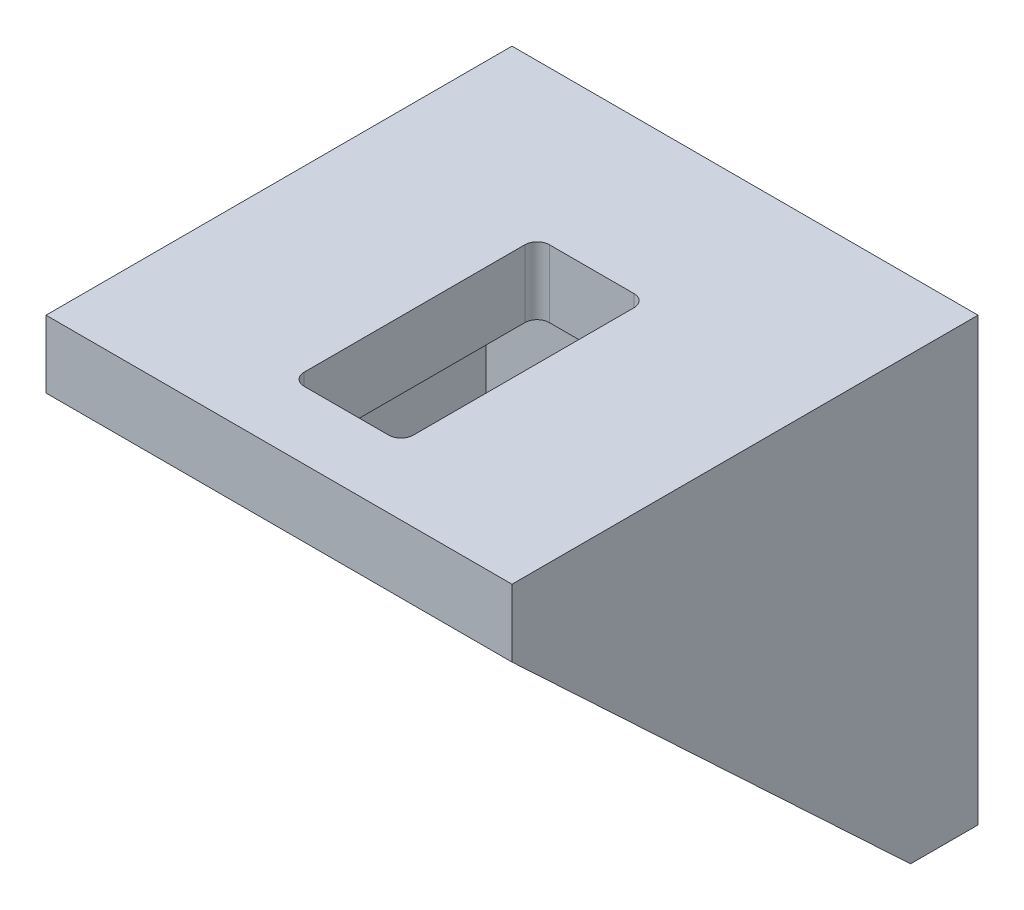
ISO-10303-21;
HEADER;
FILE_DESCRIPTION(('STEP AP214'),'2;1');
FILE_NAME('part.step','',(''),(''),'','','');
FILE_SCHEMA(('AUTOMOTIVE_DESIGN { 1 0 10303 214 1 1 1 1 }'));
ENDSEC;
DATA;
#1=APPLICATION_CONTEXT('core data for automotive mechanical design processes');
#2=APPLICATION_PROTOCOL_DEFINITION('international standard','automotive_design',2000,#1);
#3=PRODUCT_CONTEXT('',#1,'mechanical');
#4=PRODUCT('Part','Part','',(#3));
#5=PRODUCT_RELATED_PRODUCT_CATEGORY('part','',(#4));
#6=PRODUCT_DEFINITION_FORMATION('','',#4);
#7=PRODUCT_DEFINITION_CONTEXT('part definition',#1,'design');
#8=PRODUCT_DEFINITION('design','',#6,#7);
#9=PRODUCT_DEFINITION_SHAPE('','',#8);
#10=(LENGTH_UNIT() NAMED_UNIT(*) SI_UNIT(.MILLI.,.METRE.));
#11=(NAMED_UNIT(*) PLANE_ANGLE_UNIT() SI_UNIT($,.RADIAN.));
#12=(NAMED_UNIT(*) SI_UNIT($,.STERADIAN.) SOLID_ANGLE_UNIT());
#13=UNCERTAINTY_MEASURE_WITH_UNIT(LENGTH_MEASURE(1.E-05),#10,'distance_accuracy_value','');
#14=(GEOMETRIC_REPRESENTATION_CONTEXT(3) GLOBAL_UNCERTAINTY_ASSIGNED_CONTEXT((#13)) GLOBAL_UNIT_ASSIGNED_CONTEXT((#10,
#11,#12)) REPRESENTATION_CONTEXT('',''));
#15=CARTESIAN_POINT('',(0.,0.,0.));
#16=DIRECTION('',(0.,0.,1.));
#17=DIRECTION('',(1.,0.,0.));
#18=AXIS2_PLACEMENT_3D('',#15,#16,#17);
#19=CARTESIAN_POINT('',(18.,18.,3.));
#20=DIRECTION('',(0.,0.,-1.));
#21=DIRECTION('',(-1.,0.,0.));
#22=AXIS2_PLACEMENT_3D('',#19,#20,#21);
#23=CYLINDRICAL_SURFACE('',#22,10.);
#24=CARTESIAN_POINT('',(18.,18.,3.));
#25=DIRECTION('',(0.,0.,-1.));
#26=DIRECTION('',(-1.,0.,0.));
#27=AXIS2_PLACEMENT_3D('',#24,#25,#26);
#28=CIRCLE('',#27,10.);
#29=CARTESIAN_POINT('',(8.46060798583053,21.,3.));
#30=VERTEX_POINT('',#29);
#31=CARTESIAN_POINT('',(27.5,21.1224989991992,3.));
#32=VERTEX_POINT('',#31);
#33=EDGE_CURVE('E230',#30,#32,#28,.T.);
#34=ORIENTED_EDGE('',*,*,#33,.F.);
#35=DIRECTION('',(0.,0.,-1.));
#36=VECTOR('',#35,1.);
#37=CARTESIAN_POINT('',(8.46060798583054,21.,3.));
#38=LINE('',#37,#36);
#39=CARTESIAN_POINT('',(8.46060798583054,21.,0.));
#40=VERTEX_POINT('',#39);
#41=EDGE_CURVE('E640',#30,#40,#38,.T.);
#42=ORIENTED_EDGE('',*,*,#41,.T.);
#43=CARTESIAN_POINT('',(18.,18.,0.));
#44=DIRECTION('',(0.,0.,-1.));
#45=DIRECTION('',(-1.,0.,0.));
#46=AXIS2_PLACEMENT_3D('',#43,#44,#45);
#47=CIRCLE('',#46,10.);
#48=CARTESIAN_POINT('',(27.5,21.1224989991992,0.));
#49=VERTEX_POINT('',#48);
#50=EDGE_CURVE('E80',#40,#49,#47,.T.);
#51=ORIENTED_EDGE('',*,*,#50,.T.);
#52=DIRECTION('',(0.,0.,-1.));
#53=VECTOR('',#52,1.);
#54=CARTESIAN_POINT('',(27.5,21.1224989991992,3.));
#55=LINE('',#54,#53);
#56=EDGE_CURVE('E240',#32,#49,#55,.T.);
#57=ORIENTED_EDGE('',*,*,#56,.F.);
#58=EDGE_LOOP('',(#34,#42,#51,#57));
#59=FACE_BOUND('',#58,.T.);
#60=ADVANCED_FACE('F57',(#59),#23,.F.);
#61=CARTESIAN_POINT('',(0.,0.,5.5));
#62=DIRECTION('',(0.,0.,-1.));
#63=DIRECTION('',(-1.,0.,0.));
#64=AXIS2_PLACEMENT_3D('',#61,#62,#63);
#65=PLANE('',#64);
#66=DIRECTION('',(0.,1.,0.));
#67=VECTOR('',#66,1.);
#68=CARTESIAN_POINT('',(34.6,0.,5.5));
#69=LINE('',#68,#67);
#70=CARTESIAN_POINT('',(34.6,0.,5.5));
#71=VERTEX_POINT('',#70);
#72=CARTESIAN_POINT('',(34.6,30.5,5.5));
#73=VERTEX_POINT('',#72);
#74=EDGE_CURVE('E271',#71,#73,#69,.T.);
#75=ORIENTED_EDGE('',*,*,#74,.T.);
#76=DIRECTION('',(1.,0.,0.));
#77=VECTOR('',#76,1.);
#78=CARTESIAN_POINT('',(0.,30.5,5.5));
#79=LINE('',#78,#77);
#80=CARTESIAN_POINT('',(3.4,30.5,5.5));
#81=VERTEX_POINT('',#80);
#82=EDGE_CURVE('E294',#81,#73,#79,.T.);
#83=ORIENTED_EDGE('',*,*,#82,.F.);
#84=DIRECTION('',(0.,-1.,0.));
#85=VECTOR('',#84,1.);
#86=CARTESIAN_POINT('',(3.4,30.5,5.5));
#87=LINE('',#86,#85);
#88=CARTESIAN_POINT('',(3.4,0.,5.5));
#89=VERTEX_POINT('',#88);
#90=EDGE_CURVE('E285',#81,#89,#87,.T.);
#91=ORIENTED_EDGE('',*,*,#90,.T.);
#92=DIRECTION('',(1.,0.,0.));
#93=VECTOR('',#92,1.);
#94=CARTESIAN_POINT('',(0.,0.,5.5));
#95=LINE('',#94,#93);
#96=EDGE_CURVE('E316',#89,#71,#95,.T.);
#97=ORIENTED_EDGE('',*,*,#96,.T.);
#98=EDGE_LOOP('',(#75,#83,#91,#97));
#99=FACE_BOUND('',#98,.T.);
#100=ADVANCED_FACE('F417',(#99),#65,.F.);
#101=CARTESIAN_POINT('',(0.,30.5,38.));
#102=DIRECTION('',(0.,1.,0.));
#103=DIRECTION('',(0.,0.,1.));
#104=AXIS2_PLACEMENT_3D('',#101,#102,#103);
#105=PLANE('',#104);
#106=DIRECTION('',(-1.,0.,0.));
#107=VECTOR('',#106,1.);
#108=CARTESIAN_POINT('',(23.45,30.5,32.5));
#109=LINE('',#108,#107);
#110=CARTESIAN_POINT('',(22.45,30.5,32.5));
#111=VERTEX_POINT('',#110);
#112=CARTESIAN_POINT('',(15.55,30.5,32.5));
#113=VERTEX_POINT('',#112);
#114=EDGE_CURVE('E260',#111,#113,#109,.T.);
#115=ORIENTED_EDGE('',*,*,#114,.F.);
#116=CARTESIAN_POINT('',(22.45,30.5,31.5));
#117=DIRECTION('',(0.,1.,0.));
#118=DIRECTION('',(0.,0.,1.));
#119=AXIS2_PLACEMENT_3D('',#116,#117,#118);
#120=CIRCLE('',#119,1.);
#121=CARTESIAN_POINT('',(23.45,30.5,31.5));
#122=VERTEX_POINT('',#121);
#123=EDGE_CURVE('E357',#111,#122,#120,.T.);
#124=ORIENTED_EDGE('',*,*,#123,.T.);
#125=DIRECTION('',(0.,0.,1.));
#126=VECTOR('',#125,1.);
#127=CARTESIAN_POINT('',(23.45,30.5,12.5));
#128=LINE('',#127,#126);
#129=CARTESIAN_POINT('',(23.45,30.5,13.5));
#130=VERTEX_POINT('',#129);
#131=EDGE_CURVE('E242',#130,#122,#128,.T.);
#132=ORIENTED_EDGE('',*,*,#131,.F.);
#133=CARTESIAN_POINT('',(22.45,30.5,13.5));
#134=DIRECTION('',(0.,1.,0.));
#135=DIRECTION('',(0.,0.,1.));
#136=AXIS2_PLACEMENT_3D('',#133,#134,#135);
#137=CIRCLE('',#136,1.);
#138=CARTESIAN_POINT('',(22.45,30.5,12.5));
#139=VERTEX_POINT('',#138);
#140=EDGE_CURVE('E365',#130,#139,#137,.T.);
#141=ORIENTED_EDGE('',*,*,#140,.T.);
#142=DIRECTION('',(1.,0.,0.));
#143=VECTOR('',#142,1.);
#144=CARTESIAN_POINT('',(23.45,30.5,12.5));
#145=LINE('',#144,#143);
#146=CARTESIAN_POINT('',(15.55,30.5,12.5));
#147=VERTEX_POINT('',#146);
#148=EDGE_CURVE('E248',#147,#139,#145,.T.);
#149=ORIENTED_EDGE('',*,*,#148,.F.);
#150=CARTESIAN_POINT('',(15.55,30.5,13.5));
#151=DIRECTION('',(0.,1.,0.));
#152=DIRECTION('',(0.,0.,1.));
#153=AXIS2_PLACEMENT_3D('',#150,#151,#152);
#154=CIRCLE('',#153,1.);
#155=CARTESIAN_POINT('',(14.55,30.5,13.5));
#156=VERTEX_POINT('',#155);
#157=EDGE_CURVE('E65',#147,#156,#154,.T.);
#158=ORIENTED_EDGE('',*,*,#157,.T.);
#159=DIRECTION('',(0.,0.,-1.));
#160=VECTOR('',#159,1.);
#161=CARTESIAN_POINT('',(14.55,30.5,12.5));
#162=LINE('',#161,#160);
#163=CARTESIAN_POINT('',(14.55,30.5,31.5));
#164=VERTEX_POINT('',#163);
#165=EDGE_CURVE('E263',#164,#156,#162,.T.);
#166=ORIENTED_EDGE('',*,*,#165,.F.);
#167=CARTESIAN_POINT('',(15.55,30.5,31.5));
#168=DIRECTION('',(0.,1.,0.));
#169=DIRECTION('',(0.,0.,1.));
#170=AXIS2_PLACEMENT_3D('',#167,#168,#169);
#171=CIRCLE('',#170,1.);
#172=EDGE_CURVE('E361',#164,#113,#171,.T.);
#173=ORIENTED_EDGE('',*,*,#172,.T.);
#174=EDGE_LOOP('',(#115,#124,#132,#141,#149,#158,#166,#173));
#175=FACE_BOUND('',#174,.T.);
#176=DIRECTION('',(0.,0.,1.));
#177=VECTOR('',#176,1.);
#178=CARTESIAN_POINT('',(34.6,30.5,5.5));
#179=LINE('',#178,#177);
#180=CARTESIAN_POINT('',(34.6,30.5,38.));
#181=VERTEX_POINT('',#180);
#182=EDGE_CURVE('E274',#73,#181,#179,.T.);
#183=ORIENTED_EDGE('',*,*,#182,.T.);
#184=DIRECTION('',(1.,0.,0.));
#185=VECTOR('',#184,1.);
#186=CARTESIAN_POINT('',(0.,30.5,38.));
#187=LINE('',#186,#185);
#188=CARTESIAN_POINT('',(3.4,30.5,38.));
#189=VERTEX_POINT('',#188);
#190=EDGE_CURVE('E300',#189,#181,#187,.T.);
#191=ORIENTED_EDGE('',*,*,#190,.F.);
#192=DIRECTION('',(0.,0.,-1.));
#193=VECTOR('',#192,1.);
#194=CARTESIAN_POINT('',(3.4,30.5,38.));
#195=LINE('',#194,#193);
#196=EDGE_CURVE('E291',#189,#81,#195,.T.);
#197=ORIENTED_EDGE('',*,*,#196,.T.);
#198=ORIENTED_EDGE('',*,*,#82,.T.);
#199=EDGE_LOOP('',(#183,#191,#197,#198));
#200=FACE_BOUND('',#199,.T.);
#201=ADVANCED_FACE('F372',(#175,#200),#105,.F.);
#202=CARTESIAN_POINT('',(0.,0.,5.5));
#203=DIRECTION('',(1.,0.,0.));
#204=DIRECTION('',(0.,0.,-1.));
#205=AXIS2_PLACEMENT_3D('',#202,#203,#204);
#206=PLANE('',#205);
#207=DIRECTION('',(0.,-1.,0.));
#208=VECTOR('',#207,1.);
#209=CARTESIAN_POINT('',(0.,0.,0.));
#210=LINE('',#209,#208);
#211=CARTESIAN_POINT('',(0.,36.,0.));
#212=VERTEX_POINT('',#211);
#213=CARTESIAN_POINT('',(0.,21.,0.));
#214=VERTEX_POINT('',#213);
#215=EDGE_CURVE('E317',#212,#214,#210,.T.);
#216=ORIENTED_EDGE('',*,*,#215,.T.);
#217=DIRECTION('',(0.,0.,-1.));
#218=VECTOR('',#217,1.);
#219=CARTESIAN_POINT('',(0.,21.,3.));
#220=LINE('',#219,#218);
#221=CARTESIAN_POINT('',(0.,21.,3.));
#222=VERTEX_POINT('',#221);
#223=EDGE_CURVE('E642',#222,#214,#220,.T.);
#224=ORIENTED_EDGE('',*,*,#223,.F.);
#225=DIRECTION('',(0.,1.,0.));
#226=VECTOR('',#225,1.);
#227=CARTESIAN_POINT('',(0.,21.,3.));
#228=LINE('',#227,#226);
#229=CARTESIAN_POINT('',(0.,15.,3.));
#230=VERTEX_POINT('',#229);
#231=EDGE_CURVE('E215',#230,#222,#228,.T.);
#232=ORIENTED_EDGE('',*,*,#231,.F.);
#233=DIRECTION('',(0.,0.,-1.));
#234=VECTOR('',#233,1.);
#235=CARTESIAN_POINT('',(0.,15.,3.));
#236=LINE('',#235,#234);
#237=CARTESIAN_POINT('',(0.,15.,0.));
#238=VERTEX_POINT('',#237);
#239=EDGE_CURVE('E212',#230,#238,#236,.T.);
#240=ORIENTED_EDGE('',*,*,#239,.T.);
#241=CARTESIAN_POINT('',(0.,0.,0.));
#242=VERTEX_POINT('',#241);
#243=EDGE_CURVE('E310',#238,#242,#210,.T.);
#244=ORIENTED_EDGE('',*,*,#243,.T.);
#245=DIRECTION('',(0.,0.,-1.));
#246=VECTOR('',#245,1.);
#247=CARTESIAN_POINT('',(0.,0.,5.5));
#248=LINE('',#247,#246);
#249=CARTESIAN_POINT('',(0.,0.,5.5));
#250=VERTEX_POINT('',#249);
#251=EDGE_CURVE('E334',#250,#242,#248,.T.);
#252=ORIENTED_EDGE('',*,*,#251,.F.);
#253=DIRECTION('',(0.,0.684314204169172,0.729187266737642));
#254=VECTOR('',#253,1.);
#255=CARTESIAN_POINT('',(0.,0.,5.5));
#256=LINE('',#255,#254);
#257=CARTESIAN_POINT('',(0.,30.5,38.));
#258=VERTEX_POINT('',#257);
#259=EDGE_CURVE('E283',#250,#258,#256,.T.);
#260=ORIENTED_EDGE('',*,*,#259,.T.);
#261=DIRECTION('',(0.,-1.,0.));
#262=VECTOR('',#261,1.);
#263=CARTESIAN_POINT('',(0.,36.,38.));
#264=LINE('',#263,#262);
#265=CARTESIAN_POINT('',(0.,36.,38.));
#266=VERTEX_POINT('',#265);
#267=EDGE_CURVE('E297',#266,#258,#264,.T.);
#268=ORIENTED_EDGE('',*,*,#267,.F.);
#269=DIRECTION('',(0.,0.,-1.));
#270=VECTOR('',#269,1.);
#271=CARTESIAN_POINT('',(0.,36.,5.5));
#272=LINE('',#271,#270);
#273=EDGE_CURVE('E315',#266,#212,#272,.T.);
#274=ORIENTED_EDGE('',*,*,#273,.T.);
#275=EDGE_LOOP('',(#216,#224,#232,#240,#244,#252,#260,#268,#274));
#276=FACE_BOUND('',#275,.T.);
#277=ADVANCED_FACE('F510',(#276),#206,.F.);
#278=CARTESIAN_POINT('',(0.,0.,5.5));
#279=DIRECTION('',(0.,1.,0.));
#280=DIRECTION('',(0.,0.,1.));
#281=AXIS2_PLACEMENT_3D('',#278,#279,#280);
#282=PLANE('',#281);
#283=DIRECTION('',(1.,0.,0.));
#284=VECTOR('',#283,1.);
#285=CARTESIAN_POINT('',(0.,0.,0.));
#286=LINE('',#285,#284);
#287=CARTESIAN_POINT('',(38.,0.,0.));
#288=VERTEX_POINT('',#287);
#289=EDGE_CURVE('E320',#242,#288,#286,.T.);
#290=ORIENTED_EDGE('',*,*,#289,.T.);
#291=DIRECTION('',(0.,0.,-1.));
#292=VECTOR('',#291,1.);
#293=CARTESIAN_POINT('',(38.,0.,5.5));
#294=LINE('',#293,#292);
#295=CARTESIAN_POINT('',(38.,0.,5.5));
#296=VERTEX_POINT('',#295);
#297=EDGE_CURVE('E331',#296,#288,#294,.T.);
#298=ORIENTED_EDGE('',*,*,#297,.F.);
#299=DIRECTION('',(1.,0.,0.));
#300=VECTOR('',#299,1.);
#301=CARTESIAN_POINT('',(34.6,0.,5.5));
#302=LINE('',#301,#300);
#303=EDGE_CURVE('E277',#71,#296,#302,.T.);
#304=ORIENTED_EDGE('',*,*,#303,.F.);
#305=ORIENTED_EDGE('',*,*,#96,.F.);
#306=EDGE_CURVE('E313',#250,#89,#95,.T.);
#307=ORIENTED_EDGE('',*,*,#306,.F.);
#308=ORIENTED_EDGE('',*,*,#251,.T.);
#309=EDGE_LOOP('',(#290,#298,#304,#305,#307,#308));
#310=FACE_BOUND('',#309,.T.);
#311=ADVANCED_FACE('F552',(#310),#282,.F.);
#312=CARTESIAN_POINT('',(38.,0.,5.5));
#313=DIRECTION('',(-1.,0.,0.));
#314=DIRECTION('',(0.,0.,1.));
#315=AXIS2_PLACEMENT_3D('',#312,#313,#314);
#316=PLANE('',#315);
#317=DIRECTION('',(0.,1.,0.));
#318=VECTOR('',#317,1.);
#319=CARTESIAN_POINT('',(38.,0.,0.));
#320=LINE('',#319,#318);
#321=CARTESIAN_POINT('',(38.,36.,0.));
#322=VERTEX_POINT('',#321);
#323=EDGE_CURVE('E322',#288,#322,#320,.T.);
#324=ORIENTED_EDGE('',*,*,#323,.T.);
#325=DIRECTION('',(0.,0.,-1.));
#326=VECTOR('',#325,1.);
#327=CARTESIAN_POINT('',(38.,36.,5.5));
#328=LINE('',#327,#326);
#329=CARTESIAN_POINT('',(38.,36.,38.));
#330=VERTEX_POINT('',#329);
#331=EDGE_CURVE('E328',#330,#322,#328,.T.);
#332=ORIENTED_EDGE('',*,*,#331,.F.);
#333=DIRECTION('',(0.,1.,0.));
#334=VECTOR('',#333,1.);
#335=CARTESIAN_POINT('',(38.,36.,38.));
#336=LINE('',#335,#334);
#337=CARTESIAN_POINT('',(38.,30.5,38.));
#338=VERTEX_POINT('',#337);
#339=EDGE_CURVE('E304',#338,#330,#336,.T.);
#340=ORIENTED_EDGE('',*,*,#339,.F.);
#341=DIRECTION('',(0.,-0.684314204169172,-0.729187266737642));
#342=VECTOR('',#341,1.);
#343=CARTESIAN_POINT('',(38.,30.5,38.));
#344=LINE('',#343,#342);
#345=EDGE_CURVE('E257',#338,#296,#344,.T.);
#346=ORIENTED_EDGE('',*,*,#345,.T.);
#347=ORIENTED_EDGE('',*,*,#297,.T.);
#348=EDGE_LOOP('',(#324,#332,#340,#346,#347));
#349=FACE_BOUND('',#348,.T.);
#350=ADVANCED_FACE('F496',(#349),#316,.F.);
#351=CARTESIAN_POINT('',(0.,36.,5.5));
#352=DIRECTION('',(0.,-1.,0.));
#353=DIRECTION('',(0.,0.,-1.));
#354=AXIS2_PLACEMENT_3D('',#351,#352,#353);
#355=PLANE('',#354);
#356=DIRECTION('',(0.,0.,-1.));
#357=VECTOR('',#356,1.);
#358=CARTESIAN_POINT('',(14.55,36.,12.5));
#359=LINE('',#358,#357);
#360=CARTESIAN_POINT('',(14.55,36.,31.5));
#361=VERTEX_POINT('',#360);
#362=CARTESIAN_POINT('',(14.55,36.,13.5));
#363=VERTEX_POINT('',#362);
#364=EDGE_CURVE('E251',#361,#363,#359,.T.);
#365=ORIENTED_EDGE('',*,*,#364,.T.);
#366=CARTESIAN_POINT('',(15.55,36.,13.5));
#367=DIRECTION('',(0.,-1.,0.));
#368=DIRECTION('',(0.,0.,-1.));
#369=AXIS2_PLACEMENT_3D('',#366,#367,#368);
#370=CIRCLE('',#369,1.);
#371=CARTESIAN_POINT('',(15.55,36.,12.5));
#372=VERTEX_POINT('',#371);
#373=EDGE_CURVE('E13',#363,#372,#370,.T.);
#374=ORIENTED_EDGE('',*,*,#373,.T.);
#375=DIRECTION('',(1.,0.,0.));
#376=VECTOR('',#375,1.);
#377=CARTESIAN_POINT('',(23.45,36.,12.5));
#378=LINE('',#377,#376);
#379=CARTESIAN_POINT('',(22.45,36.,12.5));
#380=VERTEX_POINT('',#379);
#381=EDGE_CURVE('E254',#372,#380,#378,.T.);
#382=ORIENTED_EDGE('',*,*,#381,.T.);
#383=CARTESIAN_POINT('',(22.45,36.,13.5));
#384=DIRECTION('',(0.,-1.,0.));
#385=DIRECTION('',(0.,0.,-1.));
#386=AXIS2_PLACEMENT_3D('',#383,#384,#385);
#387=CIRCLE('',#386,1.);
#388=CARTESIAN_POINT('',(23.45,36.,13.5));
#389=VERTEX_POINT('',#388);
#390=EDGE_CURVE('E367',#380,#389,#387,.T.);
#391=ORIENTED_EDGE('',*,*,#390,.T.);
#392=DIRECTION('',(0.,0.,1.));
#393=VECTOR('',#392,1.);
#394=CARTESIAN_POINT('',(23.45,36.,12.5));
#395=LINE('',#394,#393);
#396=CARTESIAN_POINT('',(23.45,36.,31.5));
#397=VERTEX_POINT('',#396);
#398=EDGE_CURVE('E244',#389,#397,#395,.T.);
#399=ORIENTED_EDGE('',*,*,#398,.T.);
#400=CARTESIAN_POINT('',(22.45,36.,31.5));
#401=DIRECTION('',(0.,-1.,0.));
#402=DIRECTION('',(0.,0.,-1.));
#403=AXIS2_PLACEMENT_3D('',#400,#401,#402);
#404=CIRCLE('',#403,1.);
#405=CARTESIAN_POINT('',(22.45,36.,32.5));
#406=VERTEX_POINT('',#405);
#407=EDGE_CURVE('E359',#397,#406,#404,.T.);
#408=ORIENTED_EDGE('',*,*,#407,.T.);
#409=DIRECTION('',(-1.,0.,0.));
#410=VECTOR('',#409,1.);
#411=CARTESIAN_POINT('',(23.45,36.,32.5));
#412=LINE('',#411,#410);
#413=CARTESIAN_POINT('',(15.55,36.,32.5));
#414=VERTEX_POINT('',#413);
#415=EDGE_CURVE('E247',#406,#414,#412,.T.);
#416=ORIENTED_EDGE('',*,*,#415,.T.);
#417=CARTESIAN_POINT('',(15.55,36.,31.5));
#418=DIRECTION('',(0.,-1.,0.));
#419=DIRECTION('',(0.,0.,-1.));
#420=AXIS2_PLACEMENT_3D('',#417,#418,#419);
#421=CIRCLE('',#420,1.);
#422=EDGE_CURVE('E363',#414,#361,#421,.T.);
#423=ORIENTED_EDGE('',*,*,#422,.T.);
#424=EDGE_LOOP('',(#365,#374,#382,#391,#399,#408,#416,#423));
#425=FACE_BOUND('',#424,.T.);
#426=DIRECTION('',(-1.,0.,0.));
#427=VECTOR('',#426,1.);
#428=CARTESIAN_POINT('',(0.,36.,0.));
#429=LINE('',#428,#427);
#430=EDGE_CURVE('E324',#322,#212,#429,.T.);
#431=ORIENTED_EDGE('',*,*,#430,.T.);
#432=ORIENTED_EDGE('',*,*,#273,.F.);
#433=DIRECTION('',(-1.,0.,0.));
#434=VECTOR('',#433,1.);
#435=CARTESIAN_POINT('',(0.,36.,38.));
#436=LINE('',#435,#434);
#437=EDGE_CURVE('E307',#330,#266,#436,.T.);
#438=ORIENTED_EDGE('',*,*,#437,.F.);
#439=ORIENTED_EDGE('',*,*,#331,.T.);
#440=EDGE_LOOP('',(#431,#432,#438,#439));
#441=FACE_BOUND('',#440,.T.);
#442=ADVANCED_FACE('F384',(#425,#441),#355,.F.);
#443=CARTESIAN_POINT('',(0.,0.,0.));
#444=DIRECTION('',(0.,0.,-1.));
#445=DIRECTION('',(-1.,0.,0.));
#446=AXIS2_PLACEMENT_3D('',#443,#444,#445);
#447=PLANE('',#446);
#448=DIRECTION('',(1.,0.,0.));
#449=VECTOR('',#448,1.);
#450=CARTESIAN_POINT('',(8.46060798583054,21.,0.));
#451=LINE('',#450,#449);
#452=EDGE_CURVE('E216',#214,#40,#451,.T.);
#453=ORIENTED_EDGE('',*,*,#452,.F.);
#454=ORIENTED_EDGE('',*,*,#215,.F.);
#455=ORIENTED_EDGE('',*,*,#430,.F.);
#456=ORIENTED_EDGE('',*,*,#323,.F.);
#457=ORIENTED_EDGE('',*,*,#289,.F.);
#458=ORIENTED_EDGE('',*,*,#243,.F.);
#459=DIRECTION('',(-1.,0.,0.));
#460=VECTOR('',#459,1.);
#461=CARTESIAN_POINT('',(8.46060798583054,15.,0.));
#462=LINE('',#461,#460);
#463=CARTESIAN_POINT('',(8.46060798583054,15.,0.));
#464=VERTEX_POINT('',#463);
#465=EDGE_CURVE('E644',#464,#238,#462,.T.);
#466=ORIENTED_EDGE('',*,*,#465,.F.);
#467=CARTESIAN_POINT('',(27.5,14.8775010008008,0.));
#468=VERTEX_POINT('',#467);
#469=EDGE_CURVE('E224',#468,#464,#47,.T.);
#470=ORIENTED_EDGE('',*,*,#469,.F.);
#471=DIRECTION('',(0.,-1.,0.));
#472=VECTOR('',#471,1.);
#473=CARTESIAN_POINT('',(27.5,0.,0.));
#474=LINE('',#473,#472);
#475=EDGE_CURVE('E234',#49,#468,#474,.T.);
#476=ORIENTED_EDGE('',*,*,#475,.F.);
#477=ORIENTED_EDGE('',*,*,#50,.F.);
#478=EDGE_LOOP('',(#453,#454,#455,#456,#457,#458,#466,#470,#476,#477));
#479=FACE_BOUND('',#478,.T.);
#480=ADVANCED_FACE('F495',(#479),#447,.T.);
#481=CARTESIAN_POINT('',(0.,0.,38.));
#482=DIRECTION('',(0.,0.,1.));
#483=DIRECTION('',(1.,0.,0.));
#484=AXIS2_PLACEMENT_3D('',#481,#482,#483);
#485=PLANE('',#484);
#486=ORIENTED_EDGE('',*,*,#267,.T.);
#487=EDGE_CURVE('E301',#258,#189,#187,.T.);
#488=ORIENTED_EDGE('',*,*,#487,.T.);
#489=ORIENTED_EDGE('',*,*,#190,.T.);
#490=DIRECTION('',(1.,0.,0.));
#491=VECTOR('',#490,1.);
#492=CARTESIAN_POINT('',(34.6,30.5,38.));
#493=LINE('',#492,#491);
#494=EDGE_CURVE('E280',#181,#338,#493,.T.);
#495=ORIENTED_EDGE('',*,*,#494,.T.);
#496=ORIENTED_EDGE('',*,*,#339,.T.);
#497=ORIENTED_EDGE('',*,*,#437,.T.);
#498=EDGE_LOOP('',(#486,#488,#489,#495,#496,#497));
#499=FACE_BOUND('',#498,.T.);
#500=ADVANCED_FACE('F538',(#499),#485,.T.);
#501=CARTESIAN_POINT('',(3.4,0.,5.5));
#502=DIRECTION('',(0.,-0.729187266737642,0.684314204169172));
#503=DIRECTION('',(0.,-0.684314204169172,-0.729187266737642));
#504=AXIS2_PLACEMENT_3D('',#501,#502,#503);
#505=PLANE('',#504);
#506=ORIENTED_EDGE('',*,*,#259,.F.);
#507=ORIENTED_EDGE('',*,*,#306,.T.);
#508=DIRECTION('',(0.,0.684314204169172,0.729187266737642));
#509=VECTOR('',#508,1.);
#510=CARTESIAN_POINT('',(3.4,0.,5.5));
#511=LINE('',#510,#509);
#512=EDGE_CURVE('E288',#89,#189,#511,.T.);
#513=ORIENTED_EDGE('',*,*,#512,.T.);
#514=ORIENTED_EDGE('',*,*,#487,.F.);
#515=EDGE_LOOP('',(#506,#507,#513,#514));
#516=FACE_BOUND('',#515,.T.);
#517=ADVANCED_FACE('F542',(#516),#505,.T.);
#518=CARTESIAN_POINT('',(3.4,0.,0.));
#519=DIRECTION('',(1.,0.,0.));
#520=DIRECTION('',(0.,0.,-1.));
#521=AXIS2_PLACEMENT_3D('',#518,#519,#520);
#522=PLANE('',#521);
#523=ORIENTED_EDGE('',*,*,#90,.F.);
#524=ORIENTED_EDGE('',*,*,#196,.F.);
#525=ORIENTED_EDGE('',*,*,#512,.F.);
#526=EDGE_LOOP('',(#523,#524,#525));
#527=FACE_BOUND('',#526,.T.);
#528=ADVANCED_FACE('F530',(#527),#522,.T.);
#529=CARTESIAN_POINT('',(34.6,30.5,38.));
#530=DIRECTION('',(0.,-0.729187266737642,0.684314204169172));
#531=DIRECTION('',(0.,-0.684314204169172,-0.729187266737642));
#532=AXIS2_PLACEMENT_3D('',#529,#530,#531);
#533=PLANE('',#532);
#534=ORIENTED_EDGE('',*,*,#345,.F.);
#535=ORIENTED_EDGE('',*,*,#494,.F.);
#536=DIRECTION('',(0.,-0.684314204169172,-0.729187266737642));
#537=VECTOR('',#536,1.);
#538=CARTESIAN_POINT('',(34.6,30.5,38.));
#539=LINE('',#538,#537);
#540=EDGE_CURVE('E268',#181,#71,#539,.T.);
#541=ORIENTED_EDGE('',*,*,#540,.T.);
#542=ORIENTED_EDGE('',*,*,#303,.T.);
#543=EDGE_LOOP('',(#534,#535,#541,#542));
#544=FACE_BOUND('',#543,.T.);
#545=ADVANCED_FACE('F520',(#544),#533,.T.);
#546=CARTESIAN_POINT('',(34.6,0.,0.));
#547=DIRECTION('',(1.,0.,0.));
#548=DIRECTION('',(0.,0.,-1.));
#549=AXIS2_PLACEMENT_3D('',#546,#547,#548);
#550=PLANE('',#549);
#551=ORIENTED_EDGE('',*,*,#540,.F.);
#552=ORIENTED_EDGE('',*,*,#182,.F.);
#553=ORIENTED_EDGE('',*,*,#74,.F.);
#554=EDGE_LOOP('',(#551,#552,#553));
#555=FACE_BOUND('',#554,.T.);
#556=ADVANCED_FACE('F484',(#555),#550,.F.);
#557=CARTESIAN_POINT('',(23.45,36.,12.5));
#558=DIRECTION('',(1.,0.,0.));
#559=DIRECTION('',(0.,0.,-1.));
#560=AXIS2_PLACEMENT_3D('',#557,#558,#559);
#561=PLANE('',#560);
#562=ORIENTED_EDGE('',*,*,#131,.T.);
#563=DIRECTION('',(0.,-1.,0.));
#564=VECTOR('',#563,1.);
#565=CARTESIAN_POINT('',(23.45,36.,31.5));
#566=LINE('',#565,#564);
#567=EDGE_CURVE('E345',#122,#397,#566,.F.);
#568=ORIENTED_EDGE('',*,*,#567,.T.);
#569=ORIENTED_EDGE('',*,*,#398,.F.);
#570=DIRECTION('',(0.,-1.,0.));
#571=VECTOR('',#570,1.);
#572=CARTESIAN_POINT('',(23.45,30.5,13.5));
#573=LINE('',#572,#571);
#574=EDGE_CURVE('E342',#389,#130,#573,.T.);
#575=ORIENTED_EDGE('',*,*,#574,.T.);
#576=EDGE_LOOP('',(#562,#568,#569,#575));
#577=FACE_BOUND('',#576,.T.);
#578=ADVANCED_FACE('F396',(#577),#561,.F.);
#579=CARTESIAN_POINT('',(23.45,36.,12.5));
#580=DIRECTION('',(0.,0.,-1.));
#581=DIRECTION('',(-1.,0.,0.));
#582=AXIS2_PLACEMENT_3D('',#579,#580,#581);
#583=PLANE('',#582);
#584=ORIENTED_EDGE('',*,*,#148,.T.);
#585=DIRECTION('',(0.,-1.,0.));
#586=VECTOR('',#585,1.);
#587=CARTESIAN_POINT('',(22.45,36.,12.5));
#588=LINE('',#587,#586);
#589=EDGE_CURVE('E355',#139,#380,#588,.F.);
#590=ORIENTED_EDGE('',*,*,#589,.T.);
#591=ORIENTED_EDGE('',*,*,#381,.F.);
#592=DIRECTION('',(0.,-1.,0.));
#593=VECTOR('',#592,1.);
#594=CARTESIAN_POINT('',(15.55,30.5,12.5));
#595=LINE('',#594,#593);
#596=EDGE_CURVE('E352',#372,#147,#595,.T.);
#597=ORIENTED_EDGE('',*,*,#596,.T.);
#598=EDGE_LOOP('',(#584,#590,#591,#597));
#599=FACE_BOUND('',#598,.T.);
#600=ADVANCED_FACE('F388',(#599),#583,.F.);
#601=CARTESIAN_POINT('',(14.55,36.,12.5));
#602=DIRECTION('',(-1.,0.,0.));
#603=DIRECTION('',(0.,0.,1.));
#604=AXIS2_PLACEMENT_3D('',#601,#602,#603);
#605=PLANE('',#604);
#606=ORIENTED_EDGE('',*,*,#364,.F.);
#607=DIRECTION('',(0.,-1.,0.));
#608=VECTOR('',#607,1.);
#609=CARTESIAN_POINT('',(14.55,30.5,31.5));
#610=LINE('',#609,#608);
#611=EDGE_CURVE('E349',#361,#164,#610,.T.);
#612=ORIENTED_EDGE('',*,*,#611,.T.);
#613=ORIENTED_EDGE('',*,*,#165,.T.);
#614=DIRECTION('',(0.,-1.,0.));
#615=VECTOR('',#614,1.);
#616=CARTESIAN_POINT('',(14.55,36.,13.5));
#617=LINE('',#616,#615);
#618=EDGE_CURVE('E347',#156,#363,#617,.F.);
#619=ORIENTED_EDGE('',*,*,#618,.T.);
#620=EDGE_LOOP('',(#606,#612,#613,#619));
#621=FACE_BOUND('',#620,.T.);
#622=ADVANCED_FACE('F379',(#621),#605,.F.);
#623=CARTESIAN_POINT('',(23.45,36.,32.5));
#624=DIRECTION('',(0.,0.,1.));
#625=DIRECTION('',(1.,0.,0.));
#626=AXIS2_PLACEMENT_3D('',#623,#624,#625);
#627=PLANE('',#626);
#628=ORIENTED_EDGE('',*,*,#415,.F.);
#629=DIRECTION('',(0.,-1.,0.));
#630=VECTOR('',#629,1.);
#631=CARTESIAN_POINT('',(22.45,30.5,32.5));
#632=LINE('',#631,#630);
#633=EDGE_CURVE('E339',#406,#111,#632,.T.);
#634=ORIENTED_EDGE('',*,*,#633,.T.);
#635=ORIENTED_EDGE('',*,*,#114,.T.);
#636=DIRECTION('',(0.,-1.,0.));
#637=VECTOR('',#636,1.);
#638=CARTESIAN_POINT('',(15.55,36.,32.5));
#639=LINE('',#638,#637);
#640=EDGE_CURVE('E337',#113,#414,#639,.F.);
#641=ORIENTED_EDGE('',*,*,#640,.T.);
#642=EDGE_LOOP('',(#628,#634,#635,#641));
#643=FACE_BOUND('',#642,.T.);
#644=ADVANCED_FACE('F405',(#643),#627,.F.);
#645=CARTESIAN_POINT('',(22.45,36.,31.5));
#646=DIRECTION('',(0.,1.,0.));
#647=DIRECTION('',(0.,0.,1.));
#648=AXIS2_PLACEMENT_3D('',#645,#646,#647);
#649=CYLINDRICAL_SURFACE('',#648,1.);
#650=ORIENTED_EDGE('',*,*,#407,.F.);
#651=ORIENTED_EDGE('',*,*,#567,.F.);
#652=ORIENTED_EDGE('',*,*,#123,.F.);
#653=ORIENTED_EDGE('',*,*,#633,.F.);
#654=EDGE_LOOP('',(#650,#651,#652,#653));
#655=FACE_BOUND('',#654,.T.);
#656=ADVANCED_FACE('F400',(#655),#649,.F.);
#657=CARTESIAN_POINT('',(15.55,36.,31.5));
#658=DIRECTION('',(0.,1.,0.));
#659=DIRECTION('',(0.,0.,1.));
#660=AXIS2_PLACEMENT_3D('',#657,#658,#659);
#661=CYLINDRICAL_SURFACE('',#660,1.);
#662=ORIENTED_EDGE('',*,*,#422,.F.);
#663=ORIENTED_EDGE('',*,*,#640,.F.);
#664=ORIENTED_EDGE('',*,*,#172,.F.);
#665=ORIENTED_EDGE('',*,*,#611,.F.);
#666=EDGE_LOOP('',(#662,#663,#664,#665));
#667=FACE_BOUND('',#666,.T.);
#668=ADVANCED_FACE('F408',(#667),#661,.F.);
#669=CARTESIAN_POINT('',(22.45,36.,13.5));
#670=DIRECTION('',(0.,1.,0.));
#671=DIRECTION('',(0.,0.,1.));
#672=AXIS2_PLACEMENT_3D('',#669,#670,#671);
#673=CYLINDRICAL_SURFACE('',#672,1.);
#674=ORIENTED_EDGE('',*,*,#390,.F.);
#675=ORIENTED_EDGE('',*,*,#589,.F.);
#676=ORIENTED_EDGE('',*,*,#140,.F.);
#677=ORIENTED_EDGE('',*,*,#574,.F.);
#678=EDGE_LOOP('',(#674,#675,#676,#677));
#679=FACE_BOUND('',#678,.T.);
#680=ADVANCED_FACE('F391',(#679),#673,.F.);
#681=CARTESIAN_POINT('',(15.55,36.,13.5));
#682=DIRECTION('',(0.,1.,0.));
#683=DIRECTION('',(0.,0.,1.));
#684=AXIS2_PLACEMENT_3D('',#681,#682,#683);
#685=CYLINDRICAL_SURFACE('',#684,1.);
#686=ORIENTED_EDGE('',*,*,#373,.F.);
#687=ORIENTED_EDGE('',*,*,#618,.F.);
#688=ORIENTED_EDGE('',*,*,#157,.F.);
#689=ORIENTED_EDGE('',*,*,#596,.F.);
#690=EDGE_LOOP('',(#686,#687,#688,#689));
#691=FACE_BOUND('',#690,.T.);
#692=ADVANCED_FACE('F59',(#691),#685,.F.);
#693=ORIENTED_EDGE('',*,*,#469,.T.);
#694=DIRECTION('',(0.,0.,-1.));
#695=VECTOR('',#694,1.);
#696=CARTESIAN_POINT('',(8.46060798583054,15.,3.));
#697=LINE('',#696,#695);
#698=CARTESIAN_POINT('',(8.46060798583054,15.,3.));
#699=VERTEX_POINT('',#698);
#700=EDGE_CURVE('E209',#699,#464,#697,.T.);
#701=ORIENTED_EDGE('',*,*,#700,.F.);
#702=CARTESIAN_POINT('',(27.5,14.8775010008008,3.));
#703=VERTEX_POINT('',#702);
#704=EDGE_CURVE('E222',#703,#699,#28,.T.);
#705=ORIENTED_EDGE('',*,*,#704,.F.);
#706=DIRECTION('',(0.,0.,-1.));
#707=VECTOR('',#706,1.);
#708=CARTESIAN_POINT('',(27.5,14.8775010008008,3.));
#709=LINE('',#708,#707);
#710=EDGE_CURVE('E232',#703,#468,#709,.T.);
#711=ORIENTED_EDGE('',*,*,#710,.T.);
#712=EDGE_LOOP('',(#693,#701,#705,#711));
#713=FACE_BOUND('',#712,.T.);
#714=ADVANCED_FACE('F221',(#713),#23,.F.);
#715=CARTESIAN_POINT('',(27.5,0.,3.));
#716=DIRECTION('',(1.,0.,0.));
#717=DIRECTION('',(0.,0.,-1.));
#718=AXIS2_PLACEMENT_3D('',#715,#716,#717);
#719=PLANE('',#718);
#720=ORIENTED_EDGE('',*,*,#475,.T.);
#721=ORIENTED_EDGE('',*,*,#710,.F.);
#722=DIRECTION('',(0.,-1.,0.));
#723=VECTOR('',#722,1.);
#724=CARTESIAN_POINT('',(27.5,0.,3.));
#725=LINE('',#724,#723);
#726=EDGE_CURVE('E228',#32,#703,#725,.T.);
#727=ORIENTED_EDGE('',*,*,#726,.F.);
#728=ORIENTED_EDGE('',*,*,#56,.T.);
#729=EDGE_LOOP('',(#720,#721,#727,#728));
#730=FACE_BOUND('',#729,.T.);
#731=ADVANCED_FACE('F428',(#730),#719,.F.);
#732=CARTESIAN_POINT('',(19.,18.,3.));
#733=DIRECTION('',(0.,0.,-1.));
#734=DIRECTION('',(-1.,0.,0.));
#735=AXIS2_PLACEMENT_3D('',#732,#733,#734);
#736=PLANE('',#735);
#737=ORIENTED_EDGE('',*,*,#704,.T.);
#738=DIRECTION('',(-1.,0.,0.));
#739=VECTOR('',#738,1.);
#740=CARTESIAN_POINT('',(8.46060798583054,15.,3.));
#741=LINE('',#740,#739);
#742=EDGE_CURVE('E206',#699,#230,#741,.T.);
#743=ORIENTED_EDGE('',*,*,#742,.T.);
#744=ORIENTED_EDGE('',*,*,#231,.T.);
#745=DIRECTION('',(1.,0.,0.));
#746=VECTOR('',#745,1.);
#747=CARTESIAN_POINT('',(8.46060798583054,21.,3.));
#748=LINE('',#747,#746);
#749=EDGE_CURVE('E72',#222,#30,#748,.T.);
#750=ORIENTED_EDGE('',*,*,#749,.T.);
#751=ORIENTED_EDGE('',*,*,#33,.T.);
#752=ORIENTED_EDGE('',*,*,#726,.T.);
#753=EDGE_LOOP('',(#737,#743,#744,#750,#751,#752));
#754=FACE_BOUND('',#753,.T.);
#755=ADVANCED_FACE('F226',(#754),#736,.T.);
#756=CARTESIAN_POINT('',(8.46060798583054,21.,3.));
#757=DIRECTION('',(0.,1.,0.));
#758=DIRECTION('',(0.,0.,1.));
#759=AXIS2_PLACEMENT_3D('',#756,#757,#758);
#760=PLANE('',#759);
#761=ORIENTED_EDGE('',*,*,#452,.T.);
#762=ORIENTED_EDGE('',*,*,#41,.F.);
#763=ORIENTED_EDGE('',*,*,#749,.F.);
#764=ORIENTED_EDGE('',*,*,#223,.T.);
#765=EDGE_LOOP('',(#761,#762,#763,#764));
#766=FACE_BOUND('',#765,.T.);
#767=ADVANCED_FACE('F618',(#766),#760,.F.);
#768=CARTESIAN_POINT('',(8.46060798583054,15.,3.));
#769=DIRECTION('',(0.,-1.,0.));
#770=DIRECTION('',(1.,0.,0.));
#771=AXIS2_PLACEMENT_3D('',#768,#769,#770);
#772=PLANE('',#771);
#773=ORIENTED_EDGE('',*,*,#465,.T.);
#774=ORIENTED_EDGE('',*,*,#239,.F.);
#775=ORIENTED_EDGE('',*,*,#742,.F.);
#776=ORIENTED_EDGE('',*,*,#700,.T.);
#777=EDGE_LOOP('',(#773,#774,#775,#776));
#778=FACE_BOUND('',#777,.T.);
#779=ADVANCED_FACE('F208',(#778),#772,.F.);
#780=CLOSED_SHELL('',(#60,#100,#201,#277,#311,#350,#442,#480,#500,#517,#528,#545,#556,#578,#600,
#622,#644,#656,#668,#680,#692,#714,#731,#755,#767,#779));
#781=MANIFOLD_SOLID_BREP('B2',#780);
#782=ADVANCED_BREP_SHAPE_REPRESENTATION('',(#18,#781),#14);
#783=SHAPE_DEFINITION_REPRESENTATION(#9,#782);
ENDSEC;
END-ISO-10303-21;
